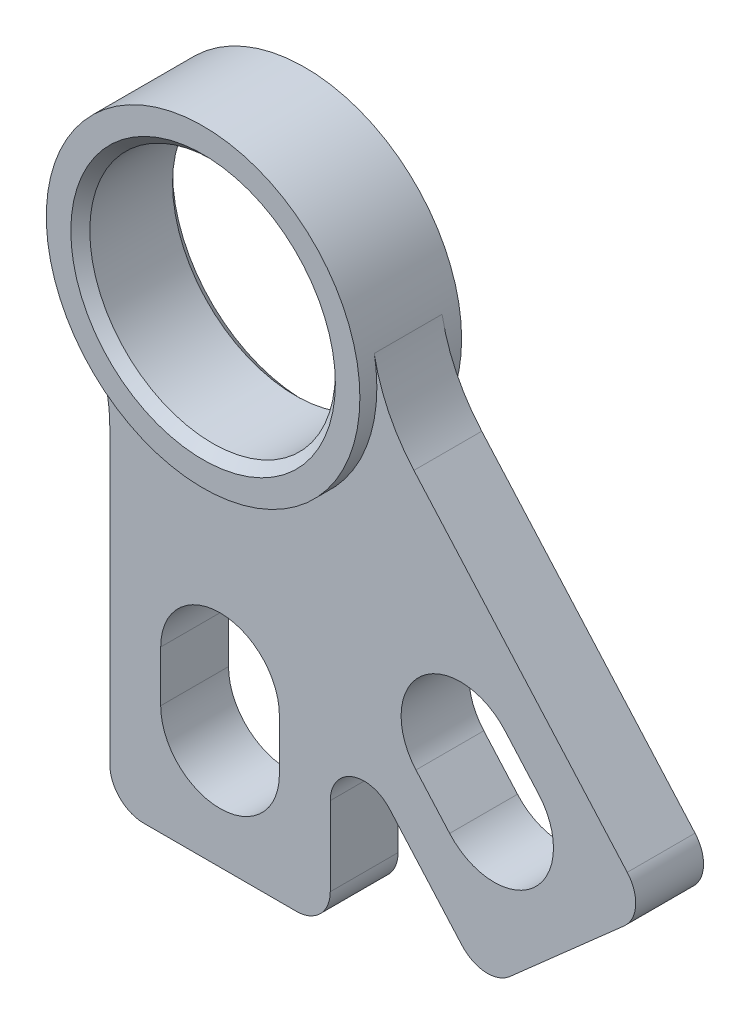
ISO-10303-21;
HEADER;
FILE_DESCRIPTION(('STEP AP214'),'2;1');
FILE_NAME('part.step','',(''),(''),'','','');
FILE_SCHEMA(('AUTOMOTIVE_DESIGN { 1 0 10303 214 1 1 1 1 }'));
ENDSEC;
DATA;
#1=APPLICATION_CONTEXT('core data for automotive mechanical design processes');
#2=APPLICATION_PROTOCOL_DEFINITION('international standard','automotive_design',2000,#1);
#3=PRODUCT_CONTEXT('',#1,'mechanical');
#4=PRODUCT('Part','Part','',(#3));
#5=PRODUCT_RELATED_PRODUCT_CATEGORY('part','',(#4));
#6=PRODUCT_DEFINITION_FORMATION('','',#4);
#7=PRODUCT_DEFINITION_CONTEXT('part definition',#1,'design');
#8=PRODUCT_DEFINITION('design','',#6,#7);
#9=PRODUCT_DEFINITION_SHAPE('','',#8);
#10=(LENGTH_UNIT() NAMED_UNIT(*) SI_UNIT(.MILLI.,.METRE.));
#11=(NAMED_UNIT(*) PLANE_ANGLE_UNIT() SI_UNIT($,.RADIAN.));
#12=(NAMED_UNIT(*) SI_UNIT($,.STERADIAN.) SOLID_ANGLE_UNIT());
#13=UNCERTAINTY_MEASURE_WITH_UNIT(LENGTH_MEASURE(1.E-05),#10,'distance_accuracy_value','');
#14=(GEOMETRIC_REPRESENTATION_CONTEXT(3) GLOBAL_UNCERTAINTY_ASSIGNED_CONTEXT((#13)) GLOBAL_UNIT_ASSIGNED_CONTEXT((#10,
#11,#12)) REPRESENTATION_CONTEXT('',''));
#15=CARTESIAN_POINT('',(0.,0.,0.));
#16=DIRECTION('',(0.,0.,1.));
#17=DIRECTION('',(1.,0.,0.));
#18=AXIS2_PLACEMENT_3D('',#15,#16,#17);
#19=CARTESIAN_POINT('',(0.,0.,4.7625));
#20=DIRECTION('',(0.,0.,-1.));
#21=DIRECTION('',(-1.,0.,0.));
#22=AXIS2_PLACEMENT_3D('',#19,#20,#21);
#23=CYLINDRICAL_SURFACE('',#22,11.495405);
#24=CARTESIAN_POINT('',(0.,0.,3.87349999999995));
#25=DIRECTION('',(0.,0.,1.));
#26=DIRECTION('',(1.,0.,0.));
#27=AXIS2_PLACEMENT_3D('',#24,#25,#26);
#28=CIRCLE('',#27,11.495405);
#29=CARTESIAN_POINT('',(-11.495405,0.,3.87349999999995));
#30=VERTEX_POINT('',#29);
#31=EDGE_CURVE('E532',#30,#30,#28,.T.);
#32=CARTESIAN_POINT('',(0.,0.,-3.87350000000001));
#33=DIRECTION('',(0.,0.,1.));
#34=DIRECTION('',(1.,0.,0.));
#35=AXIS2_PLACEMENT_3D('',#32,#33,#34);
#36=CIRCLE('',#35,11.495405);
#37=CARTESIAN_POINT('',(-11.495405,0.,-3.87350000000001));
#38=VERTEX_POINT('',#37);
#39=EDGE_CURVE('E533',#38,#38,#36,.F.);
#40=CARTESIAN_POINT('',(-11.495405,0.,3.87349999999995));
#41=CARTESIAN_POINT('',(-11.495405,0.,3.79280208333328));
#42=CARTESIAN_POINT('',(-11.495405,0.,3.71210416666662));
#43=CARTESIAN_POINT('',(-11.495405,0.,3.55070833333328));
#44=CARTESIAN_POINT('',(-11.495405,0.,3.47001041666662));
#45=CARTESIAN_POINT('',(-11.495405,0.,3.30861458333329));
#46=CARTESIAN_POINT('',(-11.495405,0.,3.22791666666662));
#47=CARTESIAN_POINT('',(-11.495405,0.,3.06652083333329));
#48=CARTESIAN_POINT('',(-11.495405,0.,2.98582291666662));
#49=CARTESIAN_POINT('',(-11.495405,0.,2.82442708333329));
#50=CARTESIAN_POINT('',(-11.495405,0.,2.74372916666662));
#51=CARTESIAN_POINT('',(-11.495405,0.,2.58233333333329));
#52=CARTESIAN_POINT('',(-11.495405,0.,2.50163541666662));
#53=CARTESIAN_POINT('',(-11.495405,0.,2.34023958333329));
#54=CARTESIAN_POINT('',(-11.495405,0.,2.25954166666662));
#55=CARTESIAN_POINT('',(-11.495405,0.,2.09814583333329));
#56=CARTESIAN_POINT('',(-11.495405,0.,2.01744791666663));
#57=CARTESIAN_POINT('',(-11.495405,0.,1.85605208333329));
#58=CARTESIAN_POINT('',(-11.495405,0.,1.77535416666663));
#59=CARTESIAN_POINT('',(-11.495405,0.,1.61395833333329));
#60=CARTESIAN_POINT('',(-11.495405,0.,1.53326041666663));
#61=CARTESIAN_POINT('',(-11.495405,0.,1.37186458333329));
#62=CARTESIAN_POINT('',(-11.495405,0.,1.29116666666663));
#63=CARTESIAN_POINT('',(-11.495405,0.,1.1297708333333));
#64=CARTESIAN_POINT('',(-11.495405,0.,1.04907291666663));
#65=CARTESIAN_POINT('',(-11.495405,0.,0.887677083333298));
#66=CARTESIAN_POINT('',(-11.495405,0.,0.806979166666632));
#67=CARTESIAN_POINT('',(-11.495405,0.,0.6455833333333));
#68=CARTESIAN_POINT('',(-11.495405,0.,0.564885416666633));
#69=CARTESIAN_POINT('',(-11.495405,0.,0.403489583333301));
#70=CARTESIAN_POINT('',(-11.495405,0.,0.322791666666634));
#71=CARTESIAN_POINT('',(-11.495405,0.,0.161395833333302));
#72=CARTESIAN_POINT('',(-11.495405,0.,0.0806979166666352));
#73=CARTESIAN_POINT('',(-11.495405,0.,-0.0806979166666974));
#74=CARTESIAN_POINT('',(-11.495405,0.,-0.161395833333363));
#75=CARTESIAN_POINT('',(-11.495405,0.,-0.322791666666696));
#76=CARTESIAN_POINT('',(-11.495405,0.,-0.403489583333362));
#77=CARTESIAN_POINT('',(-11.495405,0.,-0.564885416666694));
#78=CARTESIAN_POINT('',(-11.495405,0.,-0.64558333333336));
#79=CARTESIAN_POINT('',(-11.495405,0.,-0.806979166666693));
#80=CARTESIAN_POINT('',(-11.495405,0.,-0.88767708333336));
#81=CARTESIAN_POINT('',(-11.495405,0.,-1.04907291666669));
#82=CARTESIAN_POINT('',(-11.495405,0.,-1.12977083333336));
#83=CARTESIAN_POINT('',(-11.495405,0.,-1.29116666666669));
#84=CARTESIAN_POINT('',(-11.495405,0.,-1.37186458333336));
#85=CARTESIAN_POINT('',(-11.495405,0.,-1.53326041666669));
#86=CARTESIAN_POINT('',(-11.495405,0.,-1.61395833333336));
#87=CARTESIAN_POINT('',(-11.495405,0.,-1.77535416666669));
#88=CARTESIAN_POINT('',(-11.495405,0.,-1.85605208333335));
#89=CARTESIAN_POINT('',(-11.495405,0.,-2.01744791666669));
#90=CARTESIAN_POINT('',(-11.495405,0.,-2.09814583333335));
#91=CARTESIAN_POINT('',(-11.495405,0.,-2.25954166666669));
#92=CARTESIAN_POINT('',(-11.495405,0.,-2.34023958333335));
#93=CARTESIAN_POINT('',(-11.495405,0.,-2.50163541666668));
#94=CARTESIAN_POINT('',(-11.495405,0.,-2.58233333333335));
#95=CARTESIAN_POINT('',(-11.495405,0.,-2.74372916666668));
#96=CARTESIAN_POINT('',(-11.495405,0.,-2.82442708333335));
#97=CARTESIAN_POINT('',(-11.495405,0.,-2.98582291666668));
#98=CARTESIAN_POINT('',(-11.495405,0.,-3.06652083333335));
#99=CARTESIAN_POINT('',(-11.495405,0.,-3.22791666666668));
#100=CARTESIAN_POINT('',(-11.495405,0.,-3.30861458333335));
#101=CARTESIAN_POINT('',(-11.495405,0.,-3.47001041666668));
#102=CARTESIAN_POINT('',(-11.495405,0.,-3.55070833333335));
#103=CARTESIAN_POINT('',(-11.495405,0.,-3.71210416666668));
#104=CARTESIAN_POINT('',(-11.495405,0.,-3.79280208333334));
#105=CARTESIAN_POINT('',(-11.495405,0.,-3.87350000000001));
#106=B_SPLINE_CURVE_WITH_KNOTS('',3,(#40,#41,#42,#43,#44,#45,#46,#47,#48,#49,#50,#51,#52,#53,
#54,#55,#56,#57,#58,#59,#60,#61,#62,#63,#64,#65,#66,#67,#68,#69,#70,#71,#72,#73,#74,#75,#76,#77,
#78,#79,#80,#81,#82,#83,#84,#85,#86,#87,#88,#89,#90,#91,#92,#93,#94,#95,#96,#97,#98,#99,#100,
#101,#102,#103,#104,#105),.UNSPECIFIED.,.F.,.F.,(4,2,2,2,2,2,2,2,2,2,2,2,2,2,2,2,2,2,2,2,2,2,2,
2,2,2,2,2,2,2,2,2,4),(0.,0.242093749999999,0.484187499999997,0.726281249999996,
0.968374999999995,1.21046874999999,1.45256249999999,1.69465624999999,1.93674999999999,
2.17884374999999,2.42093749999999,2.66303124999999,2.90512499999998,3.14721874999998,
3.38931249999998,3.63140624999998,3.87349999999998,4.11559374999998,4.35768749999998,
4.59978124999997,4.84187499999998,5.08396874999997,5.32606249999997,5.56815624999997,
5.81024999999997,6.05234374999997,6.29443749999997,6.53653124999996,6.77862499999996,
7.02071874999996,7.26281249999996,7.50490624999996,7.74699999999996),.UNSPECIFIED.);
#107=EDGE_CURVE('BSEAM45',#30,#38,#106,.T.);
#108=ORIENTED_EDGE('',*,*,#31,.T.);
#109=ORIENTED_EDGE('',*,*,#39,.T.);
#110=ORIENTED_EDGE('',*,*,#107,.T.);
#111=ORIENTED_EDGE('',*,*,#107,.F.);
#112=EDGE_LOOP('',(#108,#110,#109,#111));
#113=FACE_BOUND('',#112,.T.);
#114=ADVANCED_FACE('F45',(#113),#23,.F.);
#115=CARTESIAN_POINT('',(0.,0.,4.7625));
#116=DIRECTION('',(0.,0.,-1.));
#117=DIRECTION('',(-1.,0.,0.));
#118=AXIS2_PLACEMENT_3D('',#115,#116,#117);
#119=CYLINDRICAL_SURFACE('',#118,14.6812);
#120=DIRECTION('',(0.,0.,-1.));
#121=VECTOR('',#120,1.);
#122=CARTESIAN_POINT('',(-12.585193266832,-7.55979787272702,3.175));
#123=LINE('',#122,#121);
#124=CARTESIAN_POINT('',(-12.5851932668321,-7.55979787272669,3.175));
#125=VERTEX_POINT('',#124);
#126=CARTESIAN_POINT('',(-12.585193266832,-7.55979787272702,-3.175));
#127=VERTEX_POINT('',#126);
#128=EDGE_CURVE('E209',#125,#127,#123,.T.);
#129=ORIENTED_EDGE('',*,*,#128,.F.);
#130=CARTESIAN_POINT('',(0.,0.,3.175));
#131=DIRECTION('',(0.,0.,1.));
#132=DIRECTION('',(1.,0.,0.));
#133=AXIS2_PLACEMENT_3D('',#130,#131,#132);
#134=CIRCLE('',#133,14.6812);
#135=CARTESIAN_POINT('',(14.4367287096374,2.66805127468244,3.175));
#136=VERTEX_POINT('',#135);
#137=EDGE_CURVE('E225',#125,#136,#134,.T.);
#138=ORIENTED_EDGE('',*,*,#137,.T.);
#139=DIRECTION('',(0.,0.,-1.));
#140=VECTOR('',#139,1.);
#141=CARTESIAN_POINT('',(14.4367287096373,2.66805127468242,3.175));
#142=LINE('',#141,#140);
#143=CARTESIAN_POINT('',(14.4367287096373,2.66805127468242,-3.175));
#144=VERTEX_POINT('',#143);
#145=EDGE_CURVE('E317',#136,#144,#142,.T.);
#146=ORIENTED_EDGE('',*,*,#145,.T.);
#147=CARTESIAN_POINT('',(0.,0.,-3.175));
#148=DIRECTION('',(0.,0.,1.));
#149=DIRECTION('',(1.,0.,0.));
#150=AXIS2_PLACEMENT_3D('',#147,#148,#149);
#151=CIRCLE('',#150,14.6812);
#152=EDGE_CURVE('E318',#127,#144,#151,.T.);
#153=ORIENTED_EDGE('',*,*,#152,.F.);
#154=EDGE_LOOP('',(#129,#138,#146,#153));
#155=FACE_BOUND('',#154,.T.);
#156=CARTESIAN_POINT('',(0.,0.,4.7625));
#157=DIRECTION('',(0.,0.,1.));
#158=DIRECTION('',(1.,0.,0.));
#159=AXIS2_PLACEMENT_3D('',#156,#157,#158);
#160=CIRCLE('',#159,14.6812);
#161=CARTESIAN_POINT('',(14.6812,0.,4.7625));
#162=VERTEX_POINT('',#161);
#163=EDGE_CURVE('E399',#162,#162,#160,.T.);
#164=ORIENTED_EDGE('',*,*,#163,.F.);
#165=EDGE_LOOP('',(#164));
#166=FACE_BOUND('',#165,.T.);
#167=CARTESIAN_POINT('',(0.,0.,-4.7625));
#168=DIRECTION('',(0.,0.,1.));
#169=DIRECTION('',(1.,0.,0.));
#170=AXIS2_PLACEMENT_3D('',#167,#168,#169);
#171=CIRCLE('',#170,14.6812);
#172=CARTESIAN_POINT('',(14.6812,0.,-4.7625));
#173=VERTEX_POINT('',#172);
#174=EDGE_CURVE('E403',#173,#173,#171,.T.);
#175=ORIENTED_EDGE('',*,*,#174,.T.);
#176=EDGE_LOOP('',(#175));
#177=FACE_BOUND('',#176,.T.);
#178=ADVANCED_FACE('F488',(#155,#166,#177),#119,.T.);
#179=CARTESIAN_POINT('',(0.,0.,4.7625));
#180=DIRECTION('',(0.,0.,1.));
#181=DIRECTION('',(1.,0.,0.));
#182=AXIS2_PLACEMENT_3D('',#179,#180,#181);
#183=PLANE('',#182);
#184=CARTESIAN_POINT('',(0.,0.,4.7625));
#185=DIRECTION('',(0.,0.,1.));
#186=DIRECTION('',(1.,0.,0.));
#187=AXIS2_PLACEMENT_3D('',#184,#185,#186);
#188=CIRCLE('',#187,12.3844050000001);
#189=CARTESIAN_POINT('',(12.3844050000001,0.,4.7625));
#190=VERTEX_POINT('',#189);
#191=EDGE_CURVE('E54',#190,#190,#188,.F.);
#192=ORIENTED_EDGE('',*,*,#191,.T.);
#193=EDGE_LOOP('',(#192));
#194=FACE_BOUND('',#193,.T.);
#195=ORIENTED_EDGE('',*,*,#163,.T.);
#196=EDGE_LOOP('',(#195));
#197=FACE_BOUND('',#196,.T.);
#198=ADVANCED_FACE('F496',(#194,#197),#183,.T.);
#199=CARTESIAN_POINT('',(0.,0.,-4.7625));
#200=DIRECTION('',(0.,0.,1.));
#201=DIRECTION('',(1.,0.,0.));
#202=AXIS2_PLACEMENT_3D('',#199,#200,#201);
#203=PLANE('',#202);
#204=CARTESIAN_POINT('',(0.,0.,-4.7625));
#205=DIRECTION('',(0.,0.,1.));
#206=DIRECTION('',(1.,0.,0.));
#207=AXIS2_PLACEMENT_3D('',#204,#205,#206);
#208=CIRCLE('',#207,12.384405);
#209=CARTESIAN_POINT('',(12.384405,0.,-4.7625));
#210=VERTEX_POINT('',#209);
#211=EDGE_CURVE('E12',#210,#210,#208,.T.);
#212=ORIENTED_EDGE('',*,*,#211,.T.);
#213=EDGE_LOOP('',(#212));
#214=FACE_BOUND('',#213,.T.);
#215=ORIENTED_EDGE('',*,*,#174,.F.);
#216=EDGE_LOOP('',(#215));
#217=FACE_BOUND('',#216,.T.);
#218=ADVANCED_FACE('F545',(#214,#217),#203,.F.);
#219=CARTESIAN_POINT('',(0.,-31.1330697939258,3.175));
#220=DIRECTION('',(0.,0.,-1.));
#221=DIRECTION('',(-1.,0.,0.));
#222=AXIS2_PLACEMENT_3D('',#219,#220,#221);
#223=CYLINDRICAL_SURFACE('',#222,5.5562499999984);
#224=CARTESIAN_POINT('',(0.,-31.1330697939258,-3.175));
#225=DIRECTION('',(0.,0.,1.));
#226=DIRECTION('',(1.,0.,0.));
#227=AXIS2_PLACEMENT_3D('',#224,#225,#226);
#228=CIRCLE('',#227,5.5562499999984);
#229=CARTESIAN_POINT('',(5.55624999999834,-31.1330697939258,-3.175));
#230=VERTEX_POINT('',#229);
#231=CARTESIAN_POINT('',(-5.55624999999845,-31.1330697939258,-3.175));
#232=VERTEX_POINT('',#231);
#233=EDGE_CURVE('E359',#230,#232,#228,.T.);
#234=ORIENTED_EDGE('',*,*,#233,.F.);
#235=DIRECTION('',(0.,0.,-1.));
#236=VECTOR('',#235,1.);
#237=CARTESIAN_POINT('',(5.55624999999834,-31.1330697939258,3.175));
#238=LINE('',#237,#236);
#239=CARTESIAN_POINT('',(5.55624999999834,-31.1330697939258,3.175));
#240=VERTEX_POINT('',#239);
#241=EDGE_CURVE('E381',#240,#230,#238,.T.);
#242=ORIENTED_EDGE('',*,*,#241,.F.);
#243=CARTESIAN_POINT('',(0.,-31.1330697939258,3.175));
#244=DIRECTION('',(0.,0.,1.));
#245=DIRECTION('',(1.,0.,0.));
#246=AXIS2_PLACEMENT_3D('',#243,#244,#245);
#247=CIRCLE('',#246,5.5562499999984);
#248=CARTESIAN_POINT('',(-5.55624999999845,-31.1330697939258,3.175));
#249=VERTEX_POINT('',#248);
#250=EDGE_CURVE('E292',#240,#249,#247,.T.);
#251=ORIENTED_EDGE('',*,*,#250,.T.);
#252=DIRECTION('',(0.,0.,-1.));
#253=VECTOR('',#252,1.);
#254=CARTESIAN_POINT('',(-5.55624999999845,-31.1330697939258,3.175));
#255=LINE('',#254,#253);
#256=EDGE_CURVE('E787',#249,#232,#255,.T.);
#257=ORIENTED_EDGE('',*,*,#256,.T.);
#258=EDGE_LOOP('',(#234,#242,#251,#257));
#259=FACE_BOUND('',#258,.T.);
#260=ADVANCED_FACE('F548',(#259),#223,.F.);
#261=CARTESIAN_POINT('',(5.55624999999834,0.,3.175));
#262=DIRECTION('',(-1.,0.,0.));
#263=DIRECTION('',(0.,0.,1.));
#264=AXIS2_PLACEMENT_3D('',#261,#262,#263);
#265=PLANE('',#264);
#266=DIRECTION('',(0.,1.,0.));
#267=VECTOR('',#266,1.);
#268=CARTESIAN_POINT('',(5.55624999999834,0.,-3.175));
#269=LINE('',#268,#267);
#270=CARTESIAN_POINT('',(5.55624999999834,-35.895569793929,-3.175));
#271=VERTEX_POINT('',#270);
#272=EDGE_CURVE('E363',#271,#230,#269,.T.);
#273=ORIENTED_EDGE('',*,*,#272,.F.);
#274=DIRECTION('',(0.,0.,-1.));
#275=VECTOR('',#274,1.);
#276=CARTESIAN_POINT('',(5.55624999999834,-35.895569793929,3.175));
#277=LINE('',#276,#275);
#278=CARTESIAN_POINT('',(5.55624999999834,-35.895569793929,3.175));
#279=VERTEX_POINT('',#278);
#280=EDGE_CURVE('E777',#279,#271,#277,.T.);
#281=ORIENTED_EDGE('',*,*,#280,.F.);
#282=DIRECTION('',(0.,1.,0.));
#283=VECTOR('',#282,1.);
#284=CARTESIAN_POINT('',(5.55624999999834,0.,3.175));
#285=LINE('',#284,#283);
#286=EDGE_CURVE('E297',#279,#240,#285,.T.);
#287=ORIENTED_EDGE('',*,*,#286,.T.);
#288=ORIENTED_EDGE('',*,*,#241,.T.);
#289=EDGE_LOOP('',(#273,#281,#287,#288));
#290=FACE_BOUND('',#289,.T.);
#291=ADVANCED_FACE('F554',(#290),#265,.T.);
#292=CARTESIAN_POINT('',(0.,-35.895569793929,3.175));
#293=DIRECTION('',(0.,0.,-1.));
#294=DIRECTION('',(-1.,0.,0.));
#295=AXIS2_PLACEMENT_3D('',#292,#293,#294);
#296=CYLINDRICAL_SURFACE('',#295,5.5562499999984);
#297=CARTESIAN_POINT('',(0.,-35.895569793929,-3.175));
#298=DIRECTION('',(0.,0.,1.));
#299=DIRECTION('',(1.,0.,0.));
#300=AXIS2_PLACEMENT_3D('',#297,#298,#299);
#301=CIRCLE('',#300,5.5562499999984);
#302=CARTESIAN_POINT('',(-5.55624999999845,-35.895569793929,-3.175));
#303=VERTEX_POINT('',#302);
#304=EDGE_CURVE('E369',#303,#271,#301,.T.);
#305=ORIENTED_EDGE('',*,*,#304,.F.);
#306=DIRECTION('',(0.,0.,-1.));
#307=VECTOR('',#306,1.);
#308=CARTESIAN_POINT('',(-5.55624999999845,-35.895569793929,3.175));
#309=LINE('',#308,#307);
#310=CARTESIAN_POINT('',(-5.55624999999845,-35.895569793929,3.175));
#311=VERTEX_POINT('',#310);
#312=EDGE_CURVE('E790',#311,#303,#309,.T.);
#313=ORIENTED_EDGE('',*,*,#312,.F.);
#314=CARTESIAN_POINT('',(0.,-35.895569793929,3.175));
#315=DIRECTION('',(0.,0.,1.));
#316=DIRECTION('',(1.,0.,0.));
#317=AXIS2_PLACEMENT_3D('',#314,#315,#316);
#318=CIRCLE('',#317,5.5562499999984);
#319=EDGE_CURVE('E311',#311,#279,#318,.T.);
#320=ORIENTED_EDGE('',*,*,#319,.T.);
#321=ORIENTED_EDGE('',*,*,#280,.T.);
#322=EDGE_LOOP('',(#305,#313,#320,#321));
#323=FACE_BOUND('',#322,.T.);
#324=ADVANCED_FACE('F580',(#323),#296,.F.);
#325=CARTESIAN_POINT('',(22.5066110277093,-25.4717744761362,3.175));
#326=DIRECTION('',(0.,0.,-1.));
#327=DIRECTION('',(-1.,0.,0.));
#328=AXIS2_PLACEMENT_3D('',#325,#326,#327);
#329=CYLINDRICAL_SURFACE('',#328,5.5562499999984);
#330=CARTESIAN_POINT('',(22.5066110277093,-25.4717744761362,-3.175));
#331=DIRECTION('',(0.,0.,1.));
#332=DIRECTION('',(1.,0.,0.));
#333=AXIS2_PLACEMENT_3D('',#330,#331,#332);
#334=CIRCLE('',#333,5.5562499999984);
#335=CARTESIAN_POINT('',(26.6703407854341,-21.7927435484163,-3.175));
#336=VERTEX_POINT('',#335);
#337=CARTESIAN_POINT('',(18.3428812699846,-29.150805403856,-3.175));
#338=VERTEX_POINT('',#337);
#339=EDGE_CURVE('E341',#336,#338,#334,.T.);
#340=ORIENTED_EDGE('',*,*,#339,.F.);
#341=DIRECTION('',(0.,0.,-1.));
#342=VECTOR('',#341,1.);
#343=CARTESIAN_POINT('',(26.6703407854341,-21.7927435484163,3.175));
#344=LINE('',#343,#342);
#345=CARTESIAN_POINT('',(26.6703407854341,-21.7927435484163,3.175));
#346=VERTEX_POINT('',#345);
#347=EDGE_CURVE('E791',#346,#336,#344,.T.);
#348=ORIENTED_EDGE('',*,*,#347,.F.);
#349=CARTESIAN_POINT('',(22.5066110277093,-25.4717744761362,3.175));
#350=DIRECTION('',(0.,0.,1.));
#351=DIRECTION('',(1.,0.,0.));
#352=AXIS2_PLACEMENT_3D('',#349,#350,#351);
#353=CIRCLE('',#352,5.5562499999984);
#354=CARTESIAN_POINT('',(18.3428812699846,-29.150805403856,3.175));
#355=VERTEX_POINT('',#354);
#356=EDGE_CURVE('E278',#346,#355,#353,.T.);
#357=ORIENTED_EDGE('',*,*,#356,.T.);
#358=DIRECTION('',(0.,0.,-1.));
#359=VECTOR('',#358,1.);
#360=CARTESIAN_POINT('',(18.3428812699846,-29.150805403856,3.175));
#361=LINE('',#360,#359);
#362=EDGE_CURVE('E376',#355,#338,#361,.T.);
#363=ORIENTED_EDGE('',*,*,#362,.T.);
#364=EDGE_LOOP('',(#340,#348,#357,#363));
#365=FACE_BOUND('',#364,.T.);
#366=ADVANCED_FACE('F571',(#365),#329,.F.);
#367=CARTESIAN_POINT('',(4.16372975772487,3.67903092771991,3.175));
#368=DIRECTION('',(-0.749377684180158,-0.662142799139871,0.));
#369=DIRECTION('',(0.662142799139871,-0.749377684180158,0.));
#370=AXIS2_PLACEMENT_3D('',#367,#368,#369);
#371=PLANE('',#370);
#372=DIRECTION('',(-0.662142799139871,0.749377684180158,0.));
#373=VECTOR('',#372,1.);
#374=CARTESIAN_POINT('',(4.16372975772487,3.67903092771991,-3.175));
#375=LINE('',#374,#373);
#376=CARTESIAN_POINT('',(29.8237958663399,-25.3616547693267,-3.175));
#377=VERTEX_POINT('',#376);
#378=EDGE_CURVE('E345',#377,#336,#375,.T.);
#379=ORIENTED_EDGE('',*,*,#378,.F.);
#380=DIRECTION('',(0.,0.,-1.));
#381=VECTOR('',#380,1.);
#382=CARTESIAN_POINT('',(29.8237958663399,-25.3616547693267,3.175));
#383=LINE('',#382,#381);
#384=CARTESIAN_POINT('',(29.8237958663399,-25.3616547693267,3.175));
#385=VERTEX_POINT('',#384);
#386=EDGE_CURVE('E386',#385,#377,#383,.T.);
#387=ORIENTED_EDGE('',*,*,#386,.F.);
#388=DIRECTION('',(-0.662142799139871,0.749377684180158,0.));
#389=VECTOR('',#388,1.);
#390=CARTESIAN_POINT('',(4.16372975772487,3.67903092771991,3.175));
#391=LINE('',#390,#389);
#392=EDGE_CURVE('E282',#385,#346,#391,.T.);
#393=ORIENTED_EDGE('',*,*,#392,.T.);
#394=ORIENTED_EDGE('',*,*,#347,.T.);
#395=EDGE_LOOP('',(#379,#387,#393,#394));
#396=FACE_BOUND('',#395,.T.);
#397=ADVANCED_FACE('F565',(#396),#371,.T.);
#398=CARTESIAN_POINT('',(25.6600661086151,-29.0406856970466,3.175));
#399=DIRECTION('',(0.,0.,-1.));
#400=DIRECTION('',(-1.,0.,0.));
#401=AXIS2_PLACEMENT_3D('',#398,#399,#400);
#402=CYLINDRICAL_SURFACE('',#401,5.5562499999984);
#403=CARTESIAN_POINT('',(25.6600661086151,-29.0406856970466,-3.175));
#404=DIRECTION('',(0.,0.,1.));
#405=DIRECTION('',(1.,0.,0.));
#406=AXIS2_PLACEMENT_3D('',#403,#404,#405);
#407=CIRCLE('',#406,5.5562499999984);
#408=CARTESIAN_POINT('',(21.4963363508903,-32.7197166247664,-3.175));
#409=VERTEX_POINT('',#408);
#410=EDGE_CURVE('E349',#409,#377,#407,.T.);
#411=ORIENTED_EDGE('',*,*,#410,.F.);
#412=DIRECTION('',(0.,0.,-1.));
#413=VECTOR('',#412,1.);
#414=CARTESIAN_POINT('',(21.4963363508903,-32.7197166247664,3.175));
#415=LINE('',#414,#413);
#416=CARTESIAN_POINT('',(21.4963363508903,-32.7197166247664,3.175));
#417=VERTEX_POINT('',#416);
#418=EDGE_CURVE('E380',#417,#409,#415,.T.);
#419=ORIENTED_EDGE('',*,*,#418,.F.);
#420=CARTESIAN_POINT('',(25.6600661086151,-29.0406856970466,3.175));
#421=DIRECTION('',(0.,0.,1.));
#422=DIRECTION('',(1.,0.,0.));
#423=AXIS2_PLACEMENT_3D('',#420,#421,#422);
#424=CIRCLE('',#423,5.5562499999984);
#425=EDGE_CURVE('E819',#417,#385,#424,.T.);
#426=ORIENTED_EDGE('',*,*,#425,.T.);
#427=ORIENTED_EDGE('',*,*,#386,.T.);
#428=EDGE_LOOP('',(#411,#419,#426,#427));
#429=FACE_BOUND('',#428,.T.);
#430=ADVANCED_FACE('F561',(#429),#402,.F.);
#431=CARTESIAN_POINT('',(-26.193749999998,-15.7343197939275,3.175));
#432=DIRECTION('',(0.,0.,-1.));
#433=DIRECTION('',(-1.,0.,0.));
#434=AXIS2_PLACEMENT_3D('',#431,#432,#433);
#435=CYLINDRICAL_SURFACE('',#434,15.8749999999996);
#436=CARTESIAN_POINT('',(-26.193749999998,-15.7343197939275,-3.175));
#437=DIRECTION('',(0.,0.,1.));
#438=DIRECTION('',(1.,0.,0.));
#439=AXIS2_PLACEMENT_3D('',#436,#437,#438);
#440=CIRCLE('',#439,15.8749999999996);
#441=CARTESIAN_POINT('',(-10.3187499999984,-15.7343197939275,-3.175));
#442=VERTEX_POINT('',#441);
#443=EDGE_CURVE('E205',#442,#127,#440,.T.);
#444=ORIENTED_EDGE('',*,*,#443,.F.);
#445=DIRECTION('',(0.,0.,-1.));
#446=VECTOR('',#445,1.);
#447=CARTESIAN_POINT('',(-10.3187499999984,-15.7343197939275,3.175));
#448=LINE('',#447,#446);
#449=CARTESIAN_POINT('',(-10.3187499999984,-15.7343197939275,3.175));
#450=VERTEX_POINT('',#449);
#451=EDGE_CURVE('E198',#450,#442,#448,.T.);
#452=ORIENTED_EDGE('',*,*,#451,.F.);
#453=CARTESIAN_POINT('',(-26.193749999998,-15.7343197939275,3.175));
#454=DIRECTION('',(0.,0.,1.));
#455=DIRECTION('',(1.,0.,0.));
#456=AXIS2_PLACEMENT_3D('',#453,#454,#455);
#457=CIRCLE('',#456,15.8749999999996);
#458=EDGE_CURVE('E203',#450,#125,#457,.T.);
#459=ORIENTED_EDGE('',*,*,#458,.T.);
#460=ORIENTED_EDGE('',*,*,#128,.T.);
#461=EDGE_LOOP('',(#444,#452,#459,#460));
#462=FACE_BOUND('',#461,.T.);
#463=ADVANCED_FACE('F200',(#462),#435,.F.);
#464=CARTESIAN_POINT('',(-10.3187499999984,0.,3.175));
#465=DIRECTION('',(1.,0.,0.));
#466=DIRECTION('',(0.,1.,0.));
#467=AXIS2_PLACEMENT_3D('',#464,#465,#466);
#468=PLANE('',#467);
#469=DIRECTION('',(0.,-1.,0.));
#470=VECTOR('',#469,1.);
#471=CARTESIAN_POINT('',(-10.3187499999984,0.,-3.175));
#472=LINE('',#471,#470);
#473=CARTESIAN_POINT('',(-10.3187499999984,-43.0393197939274,-3.175));
#474=VERTEX_POINT('',#473);
#475=EDGE_CURVE('E470',#442,#474,#472,.T.);
#476=ORIENTED_EDGE('',*,*,#475,.T.);
#477=DIRECTION('',(0.,0.,-1.));
#478=VECTOR('',#477,1.);
#479=CARTESIAN_POINT('',(-10.3187499999984,-43.0393197939274,3.175));
#480=LINE('',#479,#478);
#481=CARTESIAN_POINT('',(-10.3187499999984,-43.0393197939274,3.175));
#482=VERTEX_POINT('',#481);
#483=EDGE_CURVE('E216',#474,#482,#480,.F.);
#484=ORIENTED_EDGE('',*,*,#483,.T.);
#485=DIRECTION('',(0.,-1.,0.));
#486=VECTOR('',#485,1.);
#487=CARTESIAN_POINT('',(-10.3187499999984,0.,3.175));
#488=LINE('',#487,#486);
#489=EDGE_CURVE('E213',#450,#482,#488,.T.);
#490=ORIENTED_EDGE('',*,*,#489,.F.);
#491=ORIENTED_EDGE('',*,*,#451,.T.);
#492=EDGE_LOOP('',(#476,#484,#490,#491));
#493=FACE_BOUND('',#492,.T.);
#494=ADVANCED_FACE('F214',(#493),#468,.F.);
#495=CARTESIAN_POINT('',(0.,-46.2143197939274,3.175));
#496=DIRECTION('',(0.,1.,0.));
#497=DIRECTION('',(-1.,0.,0.));
#498=AXIS2_PLACEMENT_3D('',#495,#496,#497);
#499=PLANE('',#498);
#500=DIRECTION('',(1.,0.,0.));
#501=VECTOR('',#500,1.);
#502=CARTESIAN_POINT('',(0.,-46.2143197939274,-3.175));
#503=LINE('',#502,#501);
#504=CARTESIAN_POINT('',(-7.14374999999845,-46.2143197939274,-3.175));
#505=VERTEX_POINT('',#504);
#506=CARTESIAN_POINT('',(7.14374999999838,-46.2143197939274,-3.175));
#507=VERTEX_POINT('',#506);
#508=EDGE_CURVE('E467',#505,#507,#503,.T.);
#509=ORIENTED_EDGE('',*,*,#508,.T.);
#510=DIRECTION('',(0.,0.,-1.));
#511=VECTOR('',#510,1.);
#512=CARTESIAN_POINT('',(7.14374999999838,-46.2143197939274,3.175));
#513=LINE('',#512,#511);
#514=CARTESIAN_POINT('',(7.14374999999838,-46.2143197939274,3.175));
#515=VERTEX_POINT('',#514);
#516=EDGE_CURVE('E69',#507,#515,#513,.F.);
#517=ORIENTED_EDGE('',*,*,#516,.T.);
#518=DIRECTION('',(1.,0.,0.));
#519=VECTOR('',#518,1.);
#520=CARTESIAN_POINT('',(0.,-46.2143197939274,3.175));
#521=LINE('',#520,#519);
#522=CARTESIAN_POINT('',(-7.14374999999845,-46.2143197939274,3.175));
#523=VERTEX_POINT('',#522);
#524=EDGE_CURVE('E218',#523,#515,#521,.T.);
#525=ORIENTED_EDGE('',*,*,#524,.F.);
#526=DIRECTION('',(0.,0.,-1.));
#527=VECTOR('',#526,1.);
#528=CARTESIAN_POINT('',(-7.14374999999845,-46.2143197939274,3.175));
#529=LINE('',#528,#527);
#530=EDGE_CURVE('E444',#523,#505,#529,.T.);
#531=ORIENTED_EDGE('',*,*,#530,.T.);
#532=EDGE_LOOP('',(#509,#517,#525,#531));
#533=FACE_BOUND('',#532,.T.);
#534=ADVANCED_FACE('F476',(#533),#499,.F.);
#535=CARTESIAN_POINT('',(10.3187499999989,-1.16172129527295E-13,3.175));
#536=DIRECTION('',(-1.,0.,0.));
#537=DIRECTION('',(0.,-1.,0.));
#538=AXIS2_PLACEMENT_3D('',#535,#536,#537);
#539=PLANE('',#538);
#540=DIRECTION('',(0.,1.,0.));
#541=VECTOR('',#540,1.);
#542=CARTESIAN_POINT('',(10.3187499999989,-1.16172129527295E-13,-3.175));
#543=LINE('',#542,#541);
#544=CARTESIAN_POINT('',(10.3187499999984,-43.0393197939274,-3.175));
#545=VERTEX_POINT('',#544);
#546=CARTESIAN_POINT('',(10.3187499999985,-35.6504143163184,-3.175));
#547=VERTEX_POINT('',#546);
#548=EDGE_CURVE('E440',#545,#547,#543,.T.);
#549=ORIENTED_EDGE('',*,*,#548,.T.);
#550=DIRECTION('',(0.,0.,-1.));
#551=VECTOR('',#550,1.);
#552=CARTESIAN_POINT('',(10.3187499999985,-35.6504143163184,3.175));
#553=LINE('',#552,#551);
#554=CARTESIAN_POINT('',(10.3187499999985,-35.6504143163184,3.175));
#555=VERTEX_POINT('',#554);
#556=EDGE_CURVE('E413',#547,#555,#553,.F.);
#557=ORIENTED_EDGE('',*,*,#556,.T.);
#558=DIRECTION('',(0.,1.,0.));
#559=VECTOR('',#558,1.);
#560=CARTESIAN_POINT('',(10.3187499999989,-1.16172129527295E-13,3.175));
#561=LINE('',#560,#559);
#562=CARTESIAN_POINT('',(10.3187499999984,-43.0393197939274,3.175));
#563=VERTEX_POINT('',#562);
#564=EDGE_CURVE('E258',#563,#555,#561,.T.);
#565=ORIENTED_EDGE('',*,*,#564,.F.);
#566=DIRECTION('',(0.,0.,-1.));
#567=VECTOR('',#566,1.);
#568=CARTESIAN_POINT('',(10.3187499999984,-43.0393197939274,3.175));
#569=LINE('',#568,#567);
#570=EDGE_CURVE('E410',#563,#545,#569,.T.);
#571=ORIENTED_EDGE('',*,*,#570,.T.);
#572=EDGE_LOOP('',(#549,#557,#565,#571));
#573=FACE_BOUND('',#572,.T.);
#574=ADVANCED_FACE('F478',(#573),#539,.F.);
#575=CARTESIAN_POINT('',(-7.73264097863277,-6.83248600862346,3.175));
#576=DIRECTION('',(-0.749377684180158,-0.662142799139871,0.));
#577=DIRECTION('',(0.662142799139871,-0.749377684180158,0.));
#578=AXIS2_PLACEMENT_3D('',#575,#576,#577);
#579=PLANE('',#578);
#580=DIRECTION('',(-0.662142799139871,0.749377684180158,0.));
#581=VECTOR('',#580,1.);
#582=CARTESIAN_POINT('',(-7.73264097863277,-6.83248600862346,3.175));
#583=LINE('',#582,#581);
#584=CARTESIAN_POINT('',(22.6576077513366,-41.2265385370309,3.175));
#585=VERTEX_POINT('',#584);
#586=CARTESIAN_POINT('',(15.8730241472705,-33.5481109290493,3.175));
#587=VERTEX_POINT('',#586);
#588=EDGE_CURVE('E262',#585,#587,#583,.T.);
#589=ORIENTED_EDGE('',*,*,#588,.T.);
#590=DIRECTION('',(0.,0.,-1.));
#591=VECTOR('',#590,1.);
#592=CARTESIAN_POINT('',(15.8730241472705,-33.5481109290493,3.175));
#593=LINE('',#592,#591);
#594=CARTESIAN_POINT('',(15.8730241472705,-33.5481109290493,-3.175));
#595=VERTEX_POINT('',#594);
#596=EDGE_CURVE('E407',#587,#595,#593,.T.);
#597=ORIENTED_EDGE('',*,*,#596,.T.);
#598=DIRECTION('',(-0.662142799139871,0.749377684180158,0.));
#599=VECTOR('',#598,1.);
#600=CARTESIAN_POINT('',(-7.73264097863277,-6.83248600862346,-3.175));
#601=LINE('',#600,#599);
#602=CARTESIAN_POINT('',(22.6576077513366,-41.2265385370309,-3.175));
#603=VERTEX_POINT('',#602);
#604=EDGE_CURVE('E432',#603,#595,#601,.T.);
#605=ORIENTED_EDGE('',*,*,#604,.F.);
#606=DIRECTION('',(0.,0.,-1.));
#607=VECTOR('',#606,1.);
#608=CARTESIAN_POINT('',(22.6576077513366,-41.2265385370309,3.175));
#609=LINE('',#608,#607);
#610=EDGE_CURVE('E402',#603,#585,#609,.F.);
#611=ORIENTED_EDGE('',*,*,#610,.T.);
#612=EDGE_LOOP('',(#589,#597,#605,#611));
#613=FACE_BOUND('',#612,.T.);
#614=ADVANCED_FACE('F438',(#613),#579,.T.);
#615=CARTESIAN_POINT('',(32.4925521172385,-36.7733266756794,3.175));
#616=DIRECTION('',(-0.662142799139871,0.749377684180158,0.));
#617=DIRECTION('',(-0.749377684180158,-0.662142799139871,0.));
#618=AXIS2_PLACEMENT_3D('',#615,#616,#617);
#619=PLANE('',#618);
#620=DIRECTION('',(0.749377684180158,0.662142799139871,0.));
#621=VECTOR('',#620,1.);
#622=CARTESIAN_POINT('',(32.4925521172385,-36.7733266756794,3.175));
#623=LINE('',#622,#621);
#624=CARTESIAN_POINT('',(27.1391852858777,-41.5035092970338,3.175));
#625=VERTEX_POINT('',#624);
#626=CARTESIAN_POINT('',(37.8459189485994,-32.043144054325,3.175));
#627=VERTEX_POINT('',#626);
#628=EDGE_CURVE('E267',#625,#627,#623,.T.);
#629=ORIENTED_EDGE('',*,*,#628,.F.);
#630=DIRECTION('',(0.,0.,-1.));
#631=VECTOR('',#630,1.);
#632=CARTESIAN_POINT('',(27.1391852858777,-41.5035092970338,-3.175));
#633=LINE('',#632,#631);
#634=CARTESIAN_POINT('',(27.1391852858777,-41.5035092970338,-3.175));
#635=VERTEX_POINT('',#634);
#636=EDGE_CURVE('E417',#625,#635,#633,.T.);
#637=ORIENTED_EDGE('',*,*,#636,.T.);
#638=DIRECTION('',(0.749377684180158,0.662142799139871,0.));
#639=VECTOR('',#638,1.);
#640=CARTESIAN_POINT('',(32.4925521172385,-36.7733266756794,-3.175));
#641=LINE('',#640,#639);
#642=CARTESIAN_POINT('',(37.8459189485994,-32.043144054325,-3.175));
#643=VERTEX_POINT('',#642);
#644=EDGE_CURVE('E337',#635,#643,#641,.T.);
#645=ORIENTED_EDGE('',*,*,#644,.T.);
#646=DIRECTION('',(0.,0.,-1.));
#647=VECTOR('',#646,1.);
#648=CARTESIAN_POINT('',(37.8459189485994,-32.043144054325,3.175));
#649=LINE('',#648,#647);
#650=EDGE_CURVE('E415',#643,#627,#649,.F.);
#651=ORIENTED_EDGE('',*,*,#650,.T.);
#652=EDGE_LOOP('',(#629,#637,#645,#651));
#653=FACE_BOUND('',#652,.T.);
#654=ADVANCED_FACE('F590',(#653),#619,.F.);
#655=CARTESIAN_POINT('',(7.7326409786329,6.83248600862356,3.175));
#656=DIRECTION('',(-0.749377684180158,-0.66214279913987,0.));
#657=DIRECTION('',(0.66214279913987,-0.749377684180158,0.));
#658=AXIS2_PLACEMENT_3D('',#655,#656,#657);
#659=PLANE('',#658);
#660=DIRECTION('',(-0.66214279913987,0.749377684180158,0.));
#661=VECTOR('',#660,1.);
#662=CARTESIAN_POINT('',(7.7326409786329,6.83248600862356,3.175));
#663=LINE('',#662,#661);
#664=CARTESIAN_POINT('',(38.1228897086023,-27.5615665197839,3.175));
#665=VERTEX_POINT('',#664);
#666=CARTESIAN_POINT('',(18.1510075295462,-4.95846212070018,3.175));
#667=VERTEX_POINT('',#666);
#668=EDGE_CURVE('E274',#665,#667,#663,.T.);
#669=ORIENTED_EDGE('',*,*,#668,.F.);
#670=DIRECTION('',(0.,0.,-1.));
#671=VECTOR('',#670,1.);
#672=CARTESIAN_POINT('',(38.1228897086023,-27.5615665197839,3.175));
#673=LINE('',#672,#671);
#674=CARTESIAN_POINT('',(38.1228897086023,-27.5615665197839,-3.175));
#675=VERTEX_POINT('',#674);
#676=EDGE_CURVE('E451',#665,#675,#673,.T.);
#677=ORIENTED_EDGE('',*,*,#676,.T.);
#678=DIRECTION('',(-0.66214279913987,0.749377684180158,0.));
#679=VECTOR('',#678,1.);
#680=CARTESIAN_POINT('',(7.7326409786329,6.83248600862356,-3.175));
#681=LINE('',#680,#679);
#682=CARTESIAN_POINT('',(18.1510075295462,-4.95846212070018,-3.175));
#683=VERTEX_POINT('',#682);
#684=EDGE_CURVE('E332',#675,#683,#681,.T.);
#685=ORIENTED_EDGE('',*,*,#684,.T.);
#686=DIRECTION('',(0.,0.,-1.));
#687=VECTOR('',#686,1.);
#688=CARTESIAN_POINT('',(18.1510075295462,-4.95846212070018,3.175));
#689=LINE('',#688,#687);
#690=EDGE_CURVE('E210',#667,#683,#689,.T.);
#691=ORIENTED_EDGE('',*,*,#690,.F.);
#692=EDGE_LOOP('',(#669,#677,#685,#691));
#693=FACE_BOUND('',#692,.T.);
#694=ADVANCED_FACE('F587',(#693),#659,.F.);
#695=CARTESIAN_POINT('',(-4.16372975772473,-3.67903092771979,3.175));
#696=DIRECTION('',(-0.749377684180158,-0.662142799139871,0.));
#697=DIRECTION('',(0.662142799139871,-0.749377684180158,0.));
#698=AXIS2_PLACEMENT_3D('',#695,#696,#697);
#699=PLANE('',#698);
#700=DIRECTION('',(-0.662142799139871,0.749377684180158,0.));
#701=VECTOR('',#700,1.);
#702=CARTESIAN_POINT('',(-4.16372975772473,-3.67903092771979,-3.175));
#703=LINE('',#702,#701);
#704=EDGE_CURVE('E364',#409,#338,#703,.T.);
#705=ORIENTED_EDGE('',*,*,#704,.T.);
#706=ORIENTED_EDGE('',*,*,#362,.F.);
#707=DIRECTION('',(-0.662142799139871,0.749377684180158,0.));
#708=VECTOR('',#707,1.);
#709=CARTESIAN_POINT('',(-4.16372975772473,-3.67903092771979,3.175));
#710=LINE('',#709,#708);
#711=EDGE_CURVE('E298',#417,#355,#710,.T.);
#712=ORIENTED_EDGE('',*,*,#711,.F.);
#713=ORIENTED_EDGE('',*,*,#418,.T.);
#714=EDGE_LOOP('',(#705,#706,#712,#713));
#715=FACE_BOUND('',#714,.T.);
#716=ADVANCED_FACE('F576',(#715),#699,.F.);
#717=CARTESIAN_POINT('',(30.0473782659057,5.55305481564518,3.175));
#718=DIRECTION('',(0.,0.,-1.));
#719=DIRECTION('',(-1.,0.,0.));
#720=AXIS2_PLACEMENT_3D('',#717,#718,#719);
#721=CYLINDRICAL_SURFACE('',#720,15.8749999999996);
#722=CARTESIAN_POINT('',(30.0473782659057,5.55305481564518,-3.175));
#723=DIRECTION('',(0.,0.,1.));
#724=DIRECTION('',(1.,0.,0.));
#725=AXIS2_PLACEMENT_3D('',#722,#723,#724);
#726=CIRCLE('',#725,15.8749999999996);
#727=EDGE_CURVE('E336',#683,#144,#726,.F.);
#728=ORIENTED_EDGE('',*,*,#727,.T.);
#729=ORIENTED_EDGE('',*,*,#145,.F.);
#730=CARTESIAN_POINT('',(30.0473782659057,5.55305481564518,3.175));
#731=DIRECTION('',(0.,0.,1.));
#732=DIRECTION('',(1.,0.,0.));
#733=AXIS2_PLACEMENT_3D('',#730,#731,#732);
#734=CIRCLE('',#733,15.8749999999996);
#735=EDGE_CURVE('E277',#667,#136,#734,.F.);
#736=ORIENTED_EDGE('',*,*,#735,.F.);
#737=ORIENTED_EDGE('',*,*,#690,.T.);
#738=EDGE_LOOP('',(#728,#729,#736,#737));
#739=FACE_BOUND('',#738,.T.);
#740=ADVANCED_FACE('F582',(#739),#721,.F.);
#741=CARTESIAN_POINT('',(-5.55624999999845,0.,3.175));
#742=DIRECTION('',(-1.,0.,0.));
#743=DIRECTION('',(0.,0.,1.));
#744=AXIS2_PLACEMENT_3D('',#741,#742,#743);
#745=PLANE('',#744);
#746=DIRECTION('',(0.,1.,0.));
#747=VECTOR('',#746,1.);
#748=CARTESIAN_POINT('',(-5.55624999999845,0.,-3.175));
#749=LINE('',#748,#747);
#750=EDGE_CURVE('E227',#303,#232,#749,.T.);
#751=ORIENTED_EDGE('',*,*,#750,.T.);
#752=ORIENTED_EDGE('',*,*,#256,.F.);
#753=DIRECTION('',(0.,1.,0.));
#754=VECTOR('',#753,1.);
#755=CARTESIAN_POINT('',(-5.55624999999845,0.,3.175));
#756=LINE('',#755,#754);
#757=EDGE_CURVE('E314',#311,#249,#756,.T.);
#758=ORIENTED_EDGE('',*,*,#757,.F.);
#759=ORIENTED_EDGE('',*,*,#312,.T.);
#760=EDGE_LOOP('',(#751,#752,#758,#759));
#761=FACE_BOUND('',#760,.T.);
#762=ADVANCED_FACE('F585',(#761),#745,.F.);
#763=CARTESIAN_POINT('',(0.,0.,3.175));
#764=DIRECTION('',(0.,0.,1.));
#765=DIRECTION('',(1.,0.,0.));
#766=AXIS2_PLACEMENT_3D('',#763,#764,#765);
#767=PLANE('',#766);
#768=ORIENTED_EDGE('',*,*,#588,.F.);
#769=CARTESIAN_POINT('',(25.0368818986086,-39.1242351497618,3.175));
#770=DIRECTION('',(0.,0.,1.));
#771=DIRECTION('',(1.,0.,0.));
#772=AXIS2_PLACEMENT_3D('',#769,#770,#771);
#773=CIRCLE('',#772,3.175);
#774=EDGE_CURVE('E250',#585,#625,#773,.T.);
#775=ORIENTED_EDGE('',*,*,#774,.T.);
#776=ORIENTED_EDGE('',*,*,#628,.T.);
#777=CARTESIAN_POINT('',(35.7436155613303,-29.663869907053,3.175));
#778=DIRECTION('',(0.,0.,1.));
#779=DIRECTION('',(1.,0.,0.));
#780=AXIS2_PLACEMENT_3D('',#777,#778,#779);
#781=CIRCLE('',#780,3.175);
#782=EDGE_CURVE('E61',#627,#665,#781,.T.);
#783=ORIENTED_EDGE('',*,*,#782,.T.);
#784=ORIENTED_EDGE('',*,*,#668,.T.);
#785=ORIENTED_EDGE('',*,*,#735,.T.);
#786=ORIENTED_EDGE('',*,*,#137,.F.);
#787=ORIENTED_EDGE('',*,*,#458,.F.);
#788=ORIENTED_EDGE('',*,*,#489,.T.);
#789=CARTESIAN_POINT('',(-7.14374999999845,-43.0393197939274,3.175));
#790=DIRECTION('',(0.,0.,1.));
#791=DIRECTION('',(1.,0.,0.));
#792=AXIS2_PLACEMENT_3D('',#789,#790,#791);
#793=CIRCLE('',#792,3.175);
#794=EDGE_CURVE('E241',#482,#523,#793,.T.);
#795=ORIENTED_EDGE('',*,*,#794,.T.);
#796=ORIENTED_EDGE('',*,*,#524,.T.);
#797=CARTESIAN_POINT('',(7.14374999999838,-43.0393197939274,3.175));
#798=DIRECTION('',(0.,0.,1.));
#799=DIRECTION('',(1.,0.,0.));
#800=AXIS2_PLACEMENT_3D('',#797,#798,#799);
#801=CIRCLE('',#800,3.175);
#802=EDGE_CURVE('E245',#515,#563,#801,.T.);
#803=ORIENTED_EDGE('',*,*,#802,.T.);
#804=ORIENTED_EDGE('',*,*,#564,.T.);
#805=CARTESIAN_POINT('',(13.4937499999985,-35.6504143163184,3.175));
#806=DIRECTION('',(0.,0.,1.));
#807=DIRECTION('',(1.,0.,0.));
#808=AXIS2_PLACEMENT_3D('',#805,#806,#807);
#809=CIRCLE('',#808,3.175);
#810=EDGE_CURVE('E457',#555,#587,#809,.F.);
#811=ORIENTED_EDGE('',*,*,#810,.T.);
#812=EDGE_LOOP('',(#768,#775,#776,#783,#784,#785,#786,#787,#788,#795,#796,#803,#804,#811));
#813=FACE_BOUND('',#812,.T.);
#814=ORIENTED_EDGE('',*,*,#356,.F.);
#815=ORIENTED_EDGE('',*,*,#392,.F.);
#816=ORIENTED_EDGE('',*,*,#425,.F.);
#817=ORIENTED_EDGE('',*,*,#711,.T.);
#818=EDGE_LOOP('',(#814,#815,#816,#817));
#819=FACE_BOUND('',#818,.T.);
#820=ORIENTED_EDGE('',*,*,#250,.F.);
#821=ORIENTED_EDGE('',*,*,#286,.F.);
#822=ORIENTED_EDGE('',*,*,#319,.F.);
#823=ORIENTED_EDGE('',*,*,#757,.T.);
#824=EDGE_LOOP('',(#820,#821,#822,#823));
#825=FACE_BOUND('',#824,.T.);
#826=ADVANCED_FACE('F222',(#813,#819,#825),#767,.T.);
#827=CARTESIAN_POINT('',(0.,0.,-3.175));
#828=DIRECTION('',(0.,0.,1.));
#829=DIRECTION('',(1.,0.,0.));
#830=AXIS2_PLACEMENT_3D('',#827,#828,#829);
#831=PLANE('',#830);
#832=ORIENTED_EDGE('',*,*,#644,.F.);
#833=CARTESIAN_POINT('',(25.0368818986086,-39.1242351497618,-3.175));
#834=DIRECTION('',(0.,0.,1.));
#835=DIRECTION('',(1.,0.,0.));
#836=AXIS2_PLACEMENT_3D('',#833,#834,#835);
#837=CIRCLE('',#836,3.175);
#838=EDGE_CURVE('E425',#635,#603,#837,.F.);
#839=ORIENTED_EDGE('',*,*,#838,.T.);
#840=ORIENTED_EDGE('',*,*,#604,.T.);
#841=CARTESIAN_POINT('',(13.4937499999985,-35.6504143163184,-3.175));
#842=DIRECTION('',(0.,0.,1.));
#843=DIRECTION('',(1.,0.,0.));
#844=AXIS2_PLACEMENT_3D('',#841,#842,#843);
#845=CIRCLE('',#844,3.175);
#846=EDGE_CURVE('E454',#595,#547,#845,.T.);
#847=ORIENTED_EDGE('',*,*,#846,.T.);
#848=ORIENTED_EDGE('',*,*,#548,.F.);
#849=CARTESIAN_POINT('',(7.14374999999838,-43.0393197939274,-3.175));
#850=DIRECTION('',(0.,0.,1.));
#851=DIRECTION('',(1.,0.,0.));
#852=AXIS2_PLACEMENT_3D('',#849,#850,#851);
#853=CIRCLE('',#852,3.175);
#854=EDGE_CURVE('E424',#545,#507,#853,.F.);
#855=ORIENTED_EDGE('',*,*,#854,.T.);
#856=ORIENTED_EDGE('',*,*,#508,.F.);
#857=CARTESIAN_POINT('',(-7.14374999999845,-43.0393197939274,-3.175));
#858=DIRECTION('',(0.,0.,1.));
#859=DIRECTION('',(1.,0.,0.));
#860=AXIS2_PLACEMENT_3D('',#857,#858,#859);
#861=CIRCLE('',#860,3.175);
#862=EDGE_CURVE('E422',#505,#474,#861,.F.);
#863=ORIENTED_EDGE('',*,*,#862,.T.);
#864=ORIENTED_EDGE('',*,*,#475,.F.);
#865=ORIENTED_EDGE('',*,*,#443,.T.);
#866=ORIENTED_EDGE('',*,*,#152,.T.);
#867=ORIENTED_EDGE('',*,*,#727,.F.);
#868=ORIENTED_EDGE('',*,*,#684,.F.);
#869=CARTESIAN_POINT('',(35.7436155613303,-29.663869907053,-3.175));
#870=DIRECTION('',(0.,0.,1.));
#871=DIRECTION('',(1.,0.,0.));
#872=AXIS2_PLACEMENT_3D('',#869,#870,#871);
#873=CIRCLE('',#872,3.175);
#874=EDGE_CURVE('E420',#675,#643,#873,.F.);
#875=ORIENTED_EDGE('',*,*,#874,.T.);
#876=EDGE_LOOP('',(#832,#839,#840,#847,#848,#855,#856,#863,#864,#865,#866,#867,#868,#875));
#877=FACE_BOUND('',#876,.T.);
#878=ORIENTED_EDGE('',*,*,#339,.T.);
#879=ORIENTED_EDGE('',*,*,#704,.F.);
#880=ORIENTED_EDGE('',*,*,#410,.T.);
#881=ORIENTED_EDGE('',*,*,#378,.T.);
#882=EDGE_LOOP('',(#878,#879,#880,#881));
#883=FACE_BOUND('',#882,.T.);
#884=ORIENTED_EDGE('',*,*,#233,.T.);
#885=ORIENTED_EDGE('',*,*,#750,.F.);
#886=ORIENTED_EDGE('',*,*,#304,.T.);
#887=ORIENTED_EDGE('',*,*,#272,.T.);
#888=EDGE_LOOP('',(#884,#885,#886,#887));
#889=FACE_BOUND('',#888,.T.);
#890=ADVANCED_FACE('F430',(#877,#883,#889),#831,.F.);
#891=CARTESIAN_POINT('',(13.4937499999985,-35.6504143163184,3.175));
#892=DIRECTION('',(0.,0.,-1.));
#893=DIRECTION('',(-1.,0.,0.));
#894=AXIS2_PLACEMENT_3D('',#891,#892,#893);
#895=CYLINDRICAL_SURFACE('',#894,3.175);
#896=ORIENTED_EDGE('',*,*,#810,.F.);
#897=ORIENTED_EDGE('',*,*,#556,.F.);
#898=ORIENTED_EDGE('',*,*,#846,.F.);
#899=ORIENTED_EDGE('',*,*,#596,.F.);
#900=EDGE_LOOP('',(#896,#897,#898,#899));
#901=FACE_BOUND('',#900,.T.);
#902=ADVANCED_FACE('F503',(#901),#895,.F.);
#903=CARTESIAN_POINT('',(25.0368818986086,-39.1242351497618,3.175));
#904=DIRECTION('',(0.,0.,1.));
#905=DIRECTION('',(1.,0.,0.));
#906=AXIS2_PLACEMENT_3D('',#903,#904,#905);
#907=CYLINDRICAL_SURFACE('',#906,3.175);
#908=ORIENTED_EDGE('',*,*,#774,.F.);
#909=ORIENTED_EDGE('',*,*,#610,.F.);
#910=ORIENTED_EDGE('',*,*,#838,.F.);
#911=ORIENTED_EDGE('',*,*,#636,.F.);
#912=EDGE_LOOP('',(#908,#909,#910,#911));
#913=FACE_BOUND('',#912,.T.);
#914=ADVANCED_FACE('F442',(#913),#907,.T.);
#915=CARTESIAN_POINT('',(7.14374999999838,-43.0393197939274,3.175));
#916=DIRECTION('',(0.,0.,-1.));
#917=DIRECTION('',(-1.,0.,0.));
#918=AXIS2_PLACEMENT_3D('',#915,#916,#917);
#919=CYLINDRICAL_SURFACE('',#918,3.175);
#920=ORIENTED_EDGE('',*,*,#802,.F.);
#921=ORIENTED_EDGE('',*,*,#516,.F.);
#922=ORIENTED_EDGE('',*,*,#854,.F.);
#923=ORIENTED_EDGE('',*,*,#570,.F.);
#924=EDGE_LOOP('',(#920,#921,#922,#923));
#925=FACE_BOUND('',#924,.T.);
#926=ADVANCED_FACE('F509',(#925),#919,.T.);
#927=CARTESIAN_POINT('',(-7.14374999999845,-43.0393197939274,3.175));
#928=DIRECTION('',(0.,0.,-1.));
#929=DIRECTION('',(-1.,0.,0.));
#930=AXIS2_PLACEMENT_3D('',#927,#928,#929);
#931=CYLINDRICAL_SURFACE('',#930,3.175);
#932=ORIENTED_EDGE('',*,*,#794,.F.);
#933=ORIENTED_EDGE('',*,*,#483,.F.);
#934=ORIENTED_EDGE('',*,*,#862,.F.);
#935=ORIENTED_EDGE('',*,*,#530,.F.);
#936=EDGE_LOOP('',(#932,#933,#934,#935));
#937=FACE_BOUND('',#936,.T.);
#938=ADVANCED_FACE('F474',(#937),#931,.T.);
#939=CARTESIAN_POINT('',(35.7436155613303,-29.663869907053,3.175));
#940=DIRECTION('',(0.,0.,-1.));
#941=DIRECTION('',(-1.,0.,0.));
#942=AXIS2_PLACEMENT_3D('',#939,#940,#941);
#943=CYLINDRICAL_SURFACE('',#942,3.175);
#944=ORIENTED_EDGE('',*,*,#782,.F.);
#945=ORIENTED_EDGE('',*,*,#650,.F.);
#946=ORIENTED_EDGE('',*,*,#874,.F.);
#947=ORIENTED_EDGE('',*,*,#676,.F.);
#948=EDGE_LOOP('',(#944,#945,#946,#947));
#949=FACE_BOUND('',#948,.T.);
#950=ADVANCED_FACE('F515',(#949),#943,.T.);
#951=CARTESIAN_POINT('',(0.,0.,3.87349999999995));
#952=DIRECTION('',(0.,0.,1.));
#953=DIRECTION('',(1.,0.,0.));
#954=AXIS2_PLACEMENT_3D('',#951,#952,#953);
#955=CONICAL_SURFACE('',#954,11.495405,0.785398163397451);
#956=ORIENTED_EDGE('',*,*,#191,.F.);
#957=EDGE_LOOP('',(#956));
#958=FACE_BOUND('',#957,.T.);
#959=ORIENTED_EDGE('',*,*,#31,.F.);
#960=EDGE_LOOP('',(#959));
#961=FACE_BOUND('',#960,.T.);
#962=ADVANCED_FACE('F517',(#958,#961),#955,.F.);
#963=CARTESIAN_POINT('',(0.,0.,-4.7625));
#964=DIRECTION('',(0.,0.,-1.));
#965=DIRECTION('',(-1.,0.,0.));
#966=AXIS2_PLACEMENT_3D('',#963,#964,#965);
#967=CONICAL_SURFACE('',#966,12.384405,0.785398163397445);
#968=ORIENTED_EDGE('',*,*,#39,.F.);
#969=EDGE_LOOP('',(#968));
#970=FACE_BOUND('',#969,.T.);
#971=ORIENTED_EDGE('',*,*,#211,.F.);
#972=EDGE_LOOP('',(#971));
#973=FACE_BOUND('',#972,.T.);
#974=ADVANCED_FACE('F48',(#970,#973),#967,.F.);
#975=CLOSED_SHELL('',(#114,#178,#198,#218,#260,#291,#324,#366,#397,#430,#463,#494,#534,#574,
#614,#654,#694,#716,#740,#762,#826,#890,#902,#914,#926,#938,#950,#962,#974));
#976=MANIFOLD_SOLID_BREP('B2',#975);
#977=ADVANCED_BREP_SHAPE_REPRESENTATION('',(#18,#976),#14);
#978=SHAPE_DEFINITION_REPRESENTATION(#9,#977);
ENDSEC;
END-ISO-10303-21;
